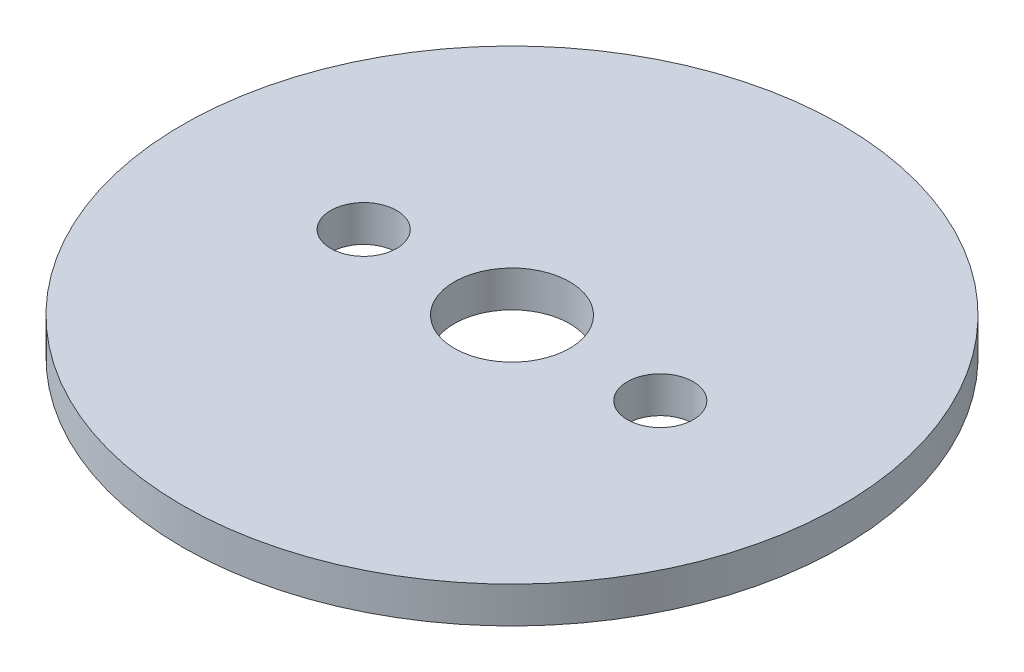
ISO-10303-21;
HEADER;
FILE_DESCRIPTION(('STEP AP214'),'2;1');
FILE_NAME('part.step','',(''),(''),'','','');
FILE_SCHEMA(('AUTOMOTIVE_DESIGN { 1 0 10303 214 1 1 1 1 }'));
ENDSEC;
DATA;
#1=APPLICATION_CONTEXT('core data for automotive mechanical design processes');
#2=APPLICATION_PROTOCOL_DEFINITION('international standard','automotive_design',2000,#1);
#3=PRODUCT_CONTEXT('',#1,'mechanical');
#4=PRODUCT('Part','Part','',(#3));
#5=PRODUCT_RELATED_PRODUCT_CATEGORY('part','',(#4));
#6=PRODUCT_DEFINITION_FORMATION('','',#4);
#7=PRODUCT_DEFINITION_CONTEXT('part definition',#1,'design');
#8=PRODUCT_DEFINITION('design','',#6,#7);
#9=PRODUCT_DEFINITION_SHAPE('','',#8);
#10=(LENGTH_UNIT() NAMED_UNIT(*) SI_UNIT(.MILLI.,.METRE.));
#11=(NAMED_UNIT(*) PLANE_ANGLE_UNIT() SI_UNIT($,.RADIAN.));
#12=(NAMED_UNIT(*) SI_UNIT($,.STERADIAN.) SOLID_ANGLE_UNIT());
#13=UNCERTAINTY_MEASURE_WITH_UNIT(LENGTH_MEASURE(1.E-05),#10,'distance_accuracy_value','');
#14=(GEOMETRIC_REPRESENTATION_CONTEXT(3) GLOBAL_UNCERTAINTY_ASSIGNED_CONTEXT((#13)) GLOBAL_UNIT_ASSIGNED_CONTEXT((#10,
#11,#12)) REPRESENTATION_CONTEXT('',''));
#15=CARTESIAN_POINT('',(0.,0.,0.));
#16=DIRECTION('',(0.,0.,1.));
#17=DIRECTION('',(1.,0.,0.));
#18=AXIS2_PLACEMENT_3D('',#15,#16,#17);
#19=CARTESIAN_POINT('',(0.,-11.,0.));
#20=DIRECTION('',(0.,1.,0.));
#21=DIRECTION('',(0.,0.,1.));
#22=AXIS2_PLACEMENT_3D('',#19,#20,#21);
#23=CYLINDRICAL_SURFACE('',#22,100.);
#24=CARTESIAN_POINT('',(0.,-11.,0.));
#25=DIRECTION('',(0.,1.,0.));
#26=DIRECTION('',(0.,0.,1.));
#27=AXIS2_PLACEMENT_3D('',#24,#25,#26);
#28=CIRCLE('',#27,100.);
#29=CARTESIAN_POINT('',(0.,-11.,100.));
#30=VERTEX_POINT('',#29);
#31=EDGE_CURVE('E10',#30,#30,#28,.T.);
#32=ORIENTED_EDGE('',*,*,#31,.T.);
#33=EDGE_LOOP('',(#32));
#34=FACE_BOUND('',#33,.T.);
#35=CARTESIAN_POINT('',(0.,0.,0.));
#36=DIRECTION('',(0.,1.,0.));
#37=DIRECTION('',(0.,0.,1.));
#38=AXIS2_PLACEMENT_3D('',#35,#36,#37);
#39=CIRCLE('',#38,100.);
#40=CARTESIAN_POINT('',(0.,0.,100.));
#41=VERTEX_POINT('',#40);
#42=EDGE_CURVE('E42',#41,#41,#39,.T.);
#43=ORIENTED_EDGE('',*,*,#42,.F.);
#44=EDGE_LOOP('',(#43));
#45=FACE_BOUND('',#44,.T.);
#46=ADVANCED_FACE('F39',(#34,#45),#23,.T.);
#47=CARTESIAN_POINT('',(0.,-11.,0.));
#48=DIRECTION('',(0.,1.,0.));
#49=DIRECTION('',(0.,0.,1.));
#50=AXIS2_PLACEMENT_3D('',#47,#48,#49);
#51=PLANE('',#50);
#52=CARTESIAN_POINT('',(45.,-11.,0.));
#53=DIRECTION('',(0.,1.,0.));
#54=DIRECTION('',(0.,0.,1.));
#55=AXIS2_PLACEMENT_3D('',#52,#53,#54);
#56=CIRCLE('',#55,9.99999999999999);
#57=CARTESIAN_POINT('',(45.,-11.,9.99999999999999));
#58=VERTEX_POINT('',#57);
#59=EDGE_CURVE('E60',#58,#58,#56,.T.);
#60=ORIENTED_EDGE('',*,*,#59,.T.);
#61=EDGE_LOOP('',(#60));
#62=FACE_BOUND('',#61,.T.);
#63=CARTESIAN_POINT('',(-45.,-11.,0.));
#64=DIRECTION('',(0.,1.,0.));
#65=DIRECTION('',(0.,0.,1.));
#66=AXIS2_PLACEMENT_3D('',#63,#64,#65);
#67=CIRCLE('',#66,10.);
#68=CARTESIAN_POINT('',(-45.,-11.,10.));
#69=VERTEX_POINT('',#68);
#70=EDGE_CURVE('E54',#69,#69,#67,.T.);
#71=ORIENTED_EDGE('',*,*,#70,.T.);
#72=EDGE_LOOP('',(#71));
#73=FACE_BOUND('',#72,.T.);
#74=CARTESIAN_POINT('',(0.,-11.,0.));
#75=DIRECTION('',(0.,1.,0.));
#76=DIRECTION('',(0.,0.,1.));
#77=AXIS2_PLACEMENT_3D('',#74,#75,#76);
#78=CIRCLE('',#77,17.5);
#79=CARTESIAN_POINT('',(0.,-11.,17.5));
#80=VERTEX_POINT('',#79);
#81=EDGE_CURVE('E49',#80,#80,#78,.T.);
#82=ORIENTED_EDGE('',*,*,#81,.T.);
#83=EDGE_LOOP('',(#82));
#84=FACE_BOUND('',#83,.T.);
#85=ORIENTED_EDGE('',*,*,#31,.F.);
#86=EDGE_LOOP('',(#85));
#87=FACE_BOUND('',#86,.T.);
#88=ADVANCED_FACE('F69',(#62,#73,#84,#87),#51,.F.);
#89=CARTESIAN_POINT('',(0.,0.,0.));
#90=DIRECTION('',(0.,1.,0.));
#91=DIRECTION('',(0.,0.,1.));
#92=AXIS2_PLACEMENT_3D('',#89,#90,#91);
#93=PLANE('',#92);
#94=CARTESIAN_POINT('',(45.,0.,0.));
#95=DIRECTION('',(0.,1.,0.));
#96=DIRECTION('',(0.,0.,1.));
#97=AXIS2_PLACEMENT_3D('',#94,#95,#96);
#98=CIRCLE('',#97,9.99999999999999);
#99=CARTESIAN_POINT('',(45.,0.,9.99999999999999));
#100=VERTEX_POINT('',#99);
#101=EDGE_CURVE('E63',#100,#100,#98,.T.);
#102=ORIENTED_EDGE('',*,*,#101,.F.);
#103=EDGE_LOOP('',(#102));
#104=FACE_BOUND('',#103,.T.);
#105=CARTESIAN_POINT('',(-45.,0.,0.));
#106=DIRECTION('',(0.,1.,0.));
#107=DIRECTION('',(0.,0.,1.));
#108=AXIS2_PLACEMENT_3D('',#105,#106,#107);
#109=CIRCLE('',#108,10.);
#110=CARTESIAN_POINT('',(-45.,0.,10.));
#111=VERTEX_POINT('',#110);
#112=EDGE_CURVE('E57',#111,#111,#109,.T.);
#113=ORIENTED_EDGE('',*,*,#112,.F.);
#114=EDGE_LOOP('',(#113));
#115=FACE_BOUND('',#114,.T.);
#116=CARTESIAN_POINT('',(0.,0.,0.));
#117=DIRECTION('',(0.,1.,0.));
#118=DIRECTION('',(0.,0.,1.));
#119=AXIS2_PLACEMENT_3D('',#116,#117,#118);
#120=CIRCLE('',#119,17.5);
#121=CARTESIAN_POINT('',(0.,0.,17.5));
#122=VERTEX_POINT('',#121);
#123=EDGE_CURVE('E51',#122,#122,#120,.T.);
#124=ORIENTED_EDGE('',*,*,#123,.F.);
#125=EDGE_LOOP('',(#124));
#126=FACE_BOUND('',#125,.T.);
#127=ORIENTED_EDGE('',*,*,#42,.T.);
#128=EDGE_LOOP('',(#127));
#129=FACE_BOUND('',#128,.T.);
#130=ADVANCED_FACE('F79',(#104,#115,#126,#129),#93,.T.);
#131=CARTESIAN_POINT('',(0.,-11.,0.));
#132=DIRECTION('',(0.,1.,0.));
#133=DIRECTION('',(0.,0.,1.));
#134=AXIS2_PLACEMENT_3D('',#131,#132,#133);
#135=CYLINDRICAL_SURFACE('',#134,17.5);
#136=ORIENTED_EDGE('',*,*,#81,.F.);
#137=EDGE_LOOP('',(#136));
#138=FACE_BOUND('',#137,.T.);
#139=ORIENTED_EDGE('',*,*,#123,.T.);
#140=EDGE_LOOP('',(#139));
#141=FACE_BOUND('',#140,.T.);
#142=ADVANCED_FACE('F82',(#138,#141),#135,.F.);
#143=CARTESIAN_POINT('',(-45.,-11.,0.));
#144=DIRECTION('',(0.,1.,0.));
#145=DIRECTION('',(0.,0.,1.));
#146=AXIS2_PLACEMENT_3D('',#143,#144,#145);
#147=CYLINDRICAL_SURFACE('',#146,10.);
#148=ORIENTED_EDGE('',*,*,#70,.F.);
#149=EDGE_LOOP('',(#148));
#150=FACE_BOUND('',#149,.T.);
#151=ORIENTED_EDGE('',*,*,#112,.T.);
#152=EDGE_LOOP('',(#151));
#153=FACE_BOUND('',#152,.T.);
#154=ADVANCED_FACE('F75',(#150,#153),#147,.F.);
#155=CARTESIAN_POINT('',(45.,-11.,0.));
#156=DIRECTION('',(0.,1.,0.));
#157=DIRECTION('',(0.,0.,1.));
#158=AXIS2_PLACEMENT_3D('',#155,#156,#157);
#159=CYLINDRICAL_SURFACE('',#158,9.99999999999999);
#160=ORIENTED_EDGE('',*,*,#59,.F.);
#161=EDGE_LOOP('',(#160));
#162=FACE_BOUND('',#161,.T.);
#163=ORIENTED_EDGE('',*,*,#101,.T.);
#164=EDGE_LOOP('',(#163));
#165=FACE_BOUND('',#164,.T.);
#166=ADVANCED_FACE('F72',(#162,#165),#159,.F.);
#167=CLOSED_SHELL('',(#46,#88,#130,#142,#154,#166));
#168=MANIFOLD_SOLID_BREP('B2',#167);
#169=ADVANCED_BREP_SHAPE_REPRESENTATION('',(#18,#168),#14);
#170=SHAPE_DEFINITION_REPRESENTATION(#9,#169);
ENDSEC;
END-ISO-10303-21;
